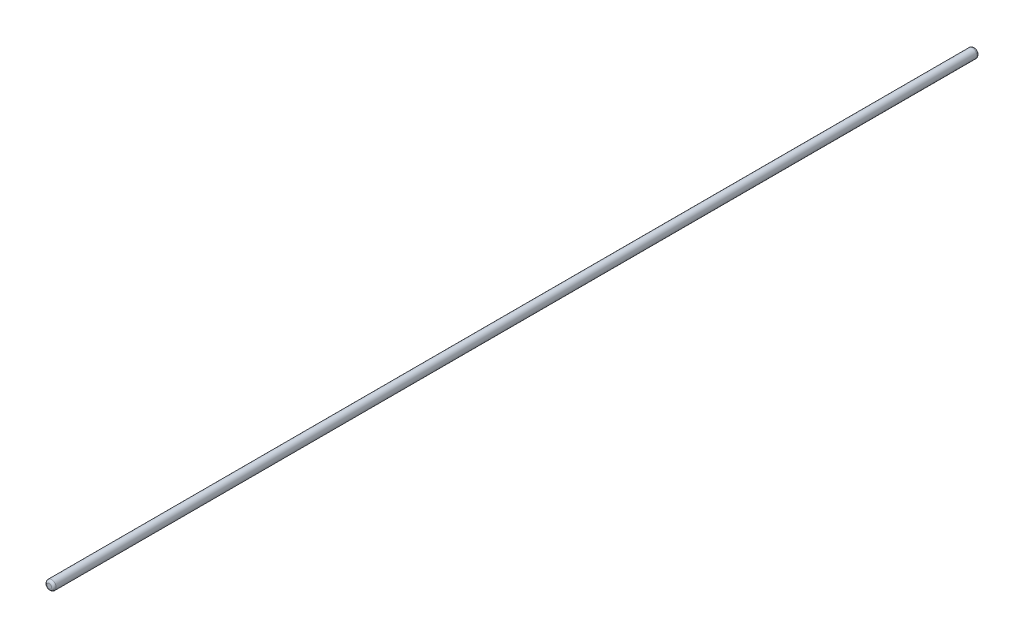
ISO-10303-21;
HEADER;
FILE_DESCRIPTION(('STEP AP214'),'2;1');
FILE_NAME('part.step','',(''),(''),'','','');
FILE_SCHEMA(('AUTOMOTIVE_DESIGN { 1 0 10303 214 1 1 1 1 }'));
ENDSEC;
DATA;
#1=APPLICATION_CONTEXT('core data for automotive mechanical design processes');
#2=APPLICATION_PROTOCOL_DEFINITION('international standard','automotive_design',2000,#1);
#3=PRODUCT_CONTEXT('',#1,'mechanical');
#4=PRODUCT('Part','Part','',(#3));
#5=PRODUCT_RELATED_PRODUCT_CATEGORY('part','',(#4));
#6=PRODUCT_DEFINITION_FORMATION('','',#4);
#7=PRODUCT_DEFINITION_CONTEXT('part definition',#1,'design');
#8=PRODUCT_DEFINITION('design','',#6,#7);
#9=PRODUCT_DEFINITION_SHAPE('','',#8);
#10=(LENGTH_UNIT() NAMED_UNIT(*) SI_UNIT(.MILLI.,.METRE.));
#11=(NAMED_UNIT(*) PLANE_ANGLE_UNIT() SI_UNIT($,.RADIAN.));
#12=(NAMED_UNIT(*) SI_UNIT($,.STERADIAN.) SOLID_ANGLE_UNIT());
#13=UNCERTAINTY_MEASURE_WITH_UNIT(LENGTH_MEASURE(1.E-05),#10,'distance_accuracy_value','');
#14=(GEOMETRIC_REPRESENTATION_CONTEXT(3) GLOBAL_UNCERTAINTY_ASSIGNED_CONTEXT((#13)) GLOBAL_UNIT_ASSIGNED_CONTEXT((#10,
#11,#12)) REPRESENTATION_CONTEXT('',''));
#15=CARTESIAN_POINT('',(0.,0.,0.));
#16=DIRECTION('',(0.,0.,1.));
#17=DIRECTION('',(1.,0.,0.));
#18=AXIS2_PLACEMENT_3D('',#15,#16,#17);
#19=CARTESIAN_POINT('',(0.,0.,300.));
#20=DIRECTION('',(0.,0.,-1.));
#21=DIRECTION('',(-1.,0.,0.));
#22=AXIS2_PLACEMENT_3D('',#19,#20,#21);
#23=CYLINDRICAL_SURFACE('',#22,1.5);
#24=CARTESIAN_POINT('',(0.,0.,0.749999999999973));
#25=DIRECTION('',(0.,0.,1.));
#26=DIRECTION('',(1.,0.,0.));
#27=AXIS2_PLACEMENT_3D('',#24,#25,#26);
#28=CIRCLE('',#27,1.5);
#29=CARTESIAN_POINT('',(1.5,0.,0.749999999999973));
#30=VERTEX_POINT('',#29);
#31=EDGE_CURVE('E58',#30,#30,#28,.T.);
#32=ORIENTED_EDGE('',*,*,#31,.T.);
#33=EDGE_LOOP('',(#32));
#34=FACE_BOUND('',#33,.T.);
#35=CARTESIAN_POINT('',(0.,0.,299.25));
#36=DIRECTION('',(0.,0.,1.));
#37=DIRECTION('',(1.,0.,0.));
#38=AXIS2_PLACEMENT_3D('',#35,#36,#37);
#39=CIRCLE('',#38,1.5);
#40=CARTESIAN_POINT('',(1.5,0.,299.25));
#41=VERTEX_POINT('',#40);
#42=EDGE_CURVE('E63',#41,#41,#39,.F.);
#43=ORIENTED_EDGE('',*,*,#42,.T.);
#44=EDGE_LOOP('',(#43));
#45=FACE_BOUND('',#44,.T.);
#46=ADVANCED_FACE('F45',(#34,#45),#23,.T.);
#47=CARTESIAN_POINT('',(0.,0.,300.));
#48=DIRECTION('',(0.,0.,1.));
#49=DIRECTION('',(1.,0.,0.));
#50=AXIS2_PLACEMENT_3D('',#47,#48,#49);
#51=PLANE('',#50);
#52=CARTESIAN_POINT('',(0.,0.,300.));
#53=DIRECTION('',(0.,0.,1.));
#54=DIRECTION('',(1.,0.,0.));
#55=AXIS2_PLACEMENT_3D('',#52,#53,#54);
#56=CIRCLE('',#55,0.75);
#57=CARTESIAN_POINT('',(0.75,0.,300.));
#58=VERTEX_POINT('',#57);
#59=EDGE_CURVE('E10',#58,#58,#56,.T.);
#60=ORIENTED_EDGE('',*,*,#59,.T.);
#61=EDGE_LOOP('',(#60));
#62=FACE_BOUND('',#61,.T.);
#63=ADVANCED_FACE('F80',(#62),#51,.T.);
#64=CARTESIAN_POINT('',(0.,0.,0.));
#65=DIRECTION('',(0.,0.,1.));
#66=DIRECTION('',(1.,0.,0.));
#67=AXIS2_PLACEMENT_3D('',#64,#65,#66);
#68=PLANE('',#67);
#69=CARTESIAN_POINT('',(0.,0.,0.));
#70=DIRECTION('',(0.,0.,1.));
#71=DIRECTION('',(1.,0.,0.));
#72=AXIS2_PLACEMENT_3D('',#69,#70,#71);
#73=CIRCLE('',#72,0.75);
#74=CARTESIAN_POINT('',(0.75,0.,0.));
#75=VERTEX_POINT('',#74);
#76=EDGE_CURVE('E53',#75,#75,#73,.F.);
#77=ORIENTED_EDGE('',*,*,#76,.T.);
#78=EDGE_LOOP('',(#77));
#79=FACE_BOUND('',#78,.T.);
#80=ADVANCED_FACE('F77',(#79),#68,.F.);
#81=CARTESIAN_POINT('',(0.,0.,0.749999999999973));
#82=DIRECTION('',(0.,0.,1.));
#83=DIRECTION('',(1.,0.,0.));
#84=AXIS2_PLACEMENT_3D('',#81,#82,#83);
#85=TOROIDAL_SURFACE('',#84,0.75,0.75);
#86=ORIENTED_EDGE('',*,*,#76,.F.);
#87=EDGE_LOOP('',(#86));
#88=FACE_BOUND('',#87,.T.);
#89=ORIENTED_EDGE('',*,*,#31,.F.);
#90=EDGE_LOOP('',(#89));
#91=FACE_BOUND('',#90,.T.);
#92=ADVANCED_FACE('F73',(#88,#91),#85,.T.);
#93=CARTESIAN_POINT('',(0.,0.,299.25));
#94=DIRECTION('',(0.,0.,1.));
#95=DIRECTION('',(1.,0.,0.));
#96=AXIS2_PLACEMENT_3D('',#93,#94,#95);
#97=TOROIDAL_SURFACE('',#96,0.75,0.75);
#98=ORIENTED_EDGE('',*,*,#42,.F.);
#99=EDGE_LOOP('',(#98));
#100=FACE_BOUND('',#99,.T.);
#101=ORIENTED_EDGE('',*,*,#59,.F.);
#102=EDGE_LOOP('',(#101));
#103=FACE_BOUND('',#102,.T.);
#104=ADVANCED_FACE('F47',(#100,#103),#97,.T.);
#105=CLOSED_SHELL('',(#46,#63,#80,#92,#104));
#106=MANIFOLD_SOLID_BREP('B2',#105);
#107=ADVANCED_BREP_SHAPE_REPRESENTATION('',(#18,#106),#14);
#108=SHAPE_DEFINITION_REPRESENTATION(#9,#107);
ENDSEC;
END-ISO-10303-21;
